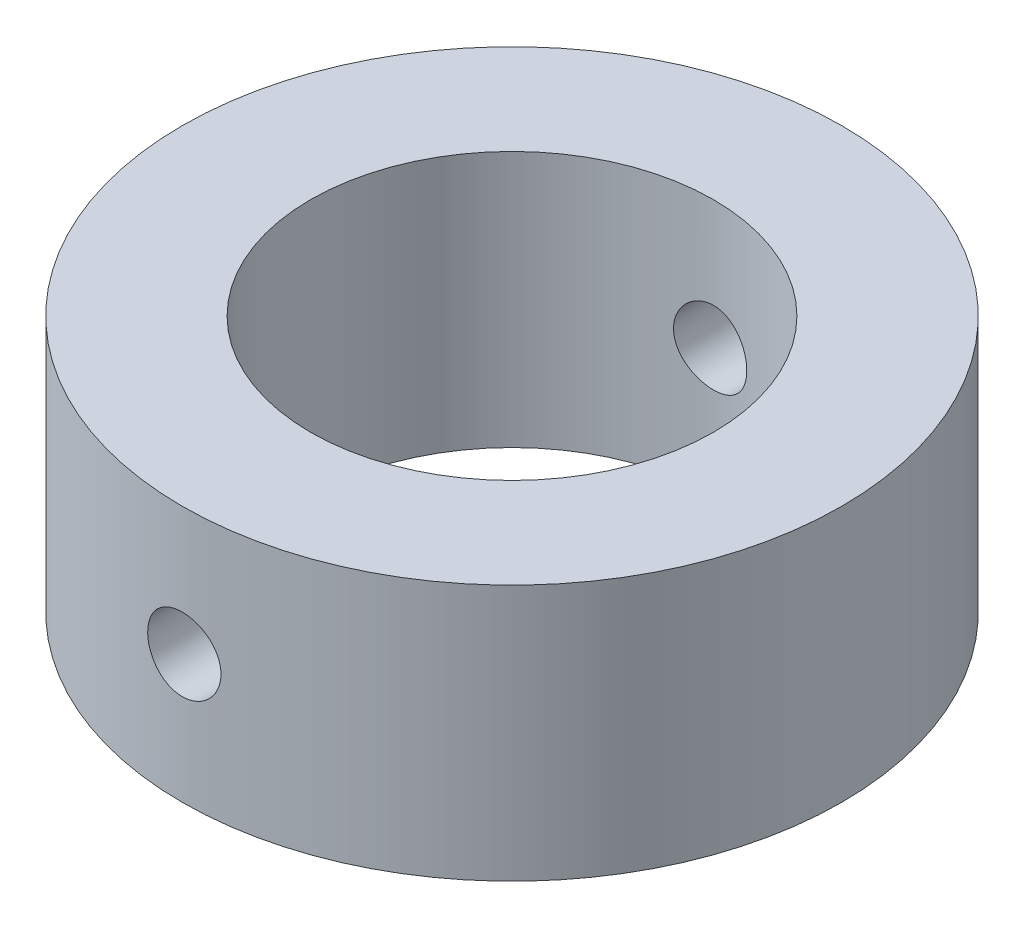
ISO-10303-21;
HEADER;
FILE_DESCRIPTION(('STEP AP214'),'2;1');
FILE_NAME('part.step','',(''),(''),'','','');
FILE_SCHEMA(('AUTOMOTIVE_DESIGN { 1 0 10303 214 1 1 1 1 }'));
ENDSEC;
DATA;
#1=APPLICATION_CONTEXT('core data for automotive mechanical design processes');
#2=APPLICATION_PROTOCOL_DEFINITION('international standard','automotive_design',2000,#1);
#3=PRODUCT_CONTEXT('',#1,'mechanical');
#4=PRODUCT('Part','Part','',(#3));
#5=PRODUCT_RELATED_PRODUCT_CATEGORY('part','',(#4));
#6=PRODUCT_DEFINITION_FORMATION('','',#4);
#7=PRODUCT_DEFINITION_CONTEXT('part definition',#1,'design');
#8=PRODUCT_DEFINITION('design','',#6,#7);
#9=PRODUCT_DEFINITION_SHAPE('','',#8);
#10=(LENGTH_UNIT() NAMED_UNIT(*) SI_UNIT(.MILLI.,.METRE.));
#11=(NAMED_UNIT(*) PLANE_ANGLE_UNIT() SI_UNIT($,.RADIAN.));
#12=(NAMED_UNIT(*) SI_UNIT($,.STERADIAN.) SOLID_ANGLE_UNIT());
#13=UNCERTAINTY_MEASURE_WITH_UNIT(LENGTH_MEASURE(1.E-05),#10,'distance_accuracy_value','');
#14=(GEOMETRIC_REPRESENTATION_CONTEXT(3) GLOBAL_UNCERTAINTY_ASSIGNED_CONTEXT((#13)) GLOBAL_UNIT_ASSIGNED_CONTEXT((#10,
#11,#12)) REPRESENTATION_CONTEXT('',''));
#15=CARTESIAN_POINT('',(0.,0.,0.));
#16=DIRECTION('',(0.,0.,1.));
#17=DIRECTION('',(1.,0.,0.));
#18=AXIS2_PLACEMENT_3D('',#15,#16,#17);
#19=CARTESIAN_POINT('',(0.,-7.728,0.));
#20=DIRECTION('',(0.,-1.,0.));
#21=DIRECTION('',(0.,0.,-1.));
#22=AXIS2_PLACEMENT_3D('',#19,#20,#21);
#23=CYLINDRICAL_SURFACE('',#22,11.);
#24=CARTESIAN_POINT('',(0.,2.,-11.));
#25=CARTESIAN_POINT('',(-0.111357271644373,1.99999568133932,-10.9999980072786));
#26=CARTESIAN_POINT('',(-0.222771449918202,1.99066824251735,-10.9982915273343));
#27=CARTESIAN_POINT('',(-0.442464406848309,1.95362653397508,-10.99164847502));
#28=CARTESIAN_POINT('',(-0.550740387266074,1.92589635141863,-10.9867091072254));
#29=CARTESIAN_POINT('',(-0.760947572513747,1.85292287032901,-10.9741532323507));
#30=CARTESIAN_POINT('',(-0.862884263930176,1.80769496781024,-10.9665390793192));
#31=CARTESIAN_POINT('',(-1.0577120033845,1.70105266880821,-10.949466714983));
#32=CARTESIAN_POINT('',(-1.15060386767904,1.63963973481181,-10.9400086703132));
#33=CARTESIAN_POINT('',(-1.32576444051238,1.50163409035729,-10.9201743349983));
#34=CARTESIAN_POINT('',(-1.40791622603346,1.42489415801924,-10.9097897259708));
#35=CARTESIAN_POINT('',(-1.55825357341079,1.25872964591017,-10.8893349521181));
#36=CARTESIAN_POINT('',(-1.62643816794977,1.16930418831085,-10.8792648091126));
#37=CARTESIAN_POINT('',(-1.74738695016477,0.979487270540227,-10.8604984020977));
#38=CARTESIAN_POINT('',(-1.80003313265556,0.879019464769625,-10.851812871101));
#39=CARTESIAN_POINT('',(-1.88765546949978,0.670481349676033,-10.836915832769));
#40=CARTESIAN_POINT('',(-1.92263305283275,0.562411655974962,-10.8307041253674));
#41=CARTESIAN_POINT('',(-1.97355197711315,0.342985350643402,-10.8215415351671));
#42=CARTESIAN_POINT('',(-1.98969666425445,0.231677408290375,-10.8185558462234));
#43=CARTESIAN_POINT('',(-2.00312248736688,0.0078955926854322,-10.8160783143231));
#44=CARTESIAN_POINT('',(-2.00040521296643,-0.104578181516031,-10.8165861769405));
#45=CARTESIAN_POINT('',(-1.97634934427,-0.326031914133018,-10.8210066504918));
#46=CARTESIAN_POINT('',(-1.95524117699072,-0.435037867895722,-10.8248771281426));
#47=CARTESIAN_POINT('',(-1.89536523340026,-0.647935018367165,-10.8355206127391));
#48=CARTESIAN_POINT('',(-1.85659674743188,-0.75182600935179,-10.8422937363232));
#49=CARTESIAN_POINT('',(-1.76227297789295,-0.952222790778736,-10.8580238155272));
#50=CARTESIAN_POINT('',(-1.7066239037154,-1.04868344266613,-10.8669929171435));
#51=CARTESIAN_POINT('',(-1.58018503374043,-1.23098473694529,-10.8860962201172));
#52=CARTESIAN_POINT('',(-1.50939379023584,-1.31682436264624,-10.8962305328347));
#53=CARTESIAN_POINT('',(-1.35343399418352,-1.47677899644437,-10.9167064080854));
#54=CARTESIAN_POINT('',(-1.2680681726569,-1.55070168843691,-10.9270488181647));
#55=CARTESIAN_POINT('',(-1.08604454069331,-1.68320513348083,-10.9466375043709));
#56=CARTESIAN_POINT('',(-0.989386629498157,-1.74178574962126,-10.9558837707156));
#57=CARTESIAN_POINT('',(-0.787327598497296,-1.84196738978503,-10.9722553782534));
#58=CARTESIAN_POINT('',(-0.681916780395492,-1.88354926869598,-10.9793783255922));
#59=CARTESIAN_POINT('',(-0.465448414462666,-1.9483631924937,-10.9906820547088));
#60=CARTESIAN_POINT('',(-0.354391431316065,-1.97159706857391,-10.994863130091));
#61=CARTESIAN_POINT('',(-0.131438649578499,-1.99878976191912,-10.9997719337866));
#62=CARTESIAN_POINT('',(-0.0195760121089339,-2.00301222345408,-11.0005468934114));
#63=CARTESIAN_POINT('',(0.203257238970967,-1.99276820181851,-10.998686302475));
#64=CARTESIAN_POINT('',(0.314227893453082,-1.97830257992826,-10.9960509090871));
#65=CARTESIAN_POINT('',(0.531297097592757,-1.93131225043812,-10.9876950863245));
#66=CARTESIAN_POINT('',(0.637425297458317,-1.89892013081717,-10.9819973157216));
#67=CARTESIAN_POINT('',(0.84274471375661,-1.81713917147806,-10.9681529512222));
#68=CARTESIAN_POINT('',(0.941935480960949,-1.7677492323023,-10.9600061989244));
#69=CARTESIAN_POINT('',(1.13169524707493,-1.65278536219707,-10.9420497958484));
#70=CARTESIAN_POINT('',(1.22216445208488,-1.58704931284408,-10.932223816146));
#71=CARTESIAN_POINT('',(1.39088213822347,-1.4414796233289,-10.9120428807109));
#72=CARTESIAN_POINT('',(1.46912954974332,-1.36164475058806,-10.901687878785));
#73=CARTESIAN_POINT('',(1.6121773788768,-1.1889531185515,-10.8814603955764));
#74=CARTESIAN_POINT('',(1.67679836741418,-1.09594669347414,-10.8715955212189));
#75=CARTESIAN_POINT('',(1.78949986552014,-0.900243818593513,-10.8536151008102));
#76=CARTESIAN_POINT('',(1.83758096630795,-0.797547715315616,-10.8454994922354));
#77=CARTESIAN_POINT('',(1.91557945241746,-0.585849250308254,-10.8319954461548));
#78=CARTESIAN_POINT('',(1.9455810786184,-0.476878769261946,-10.8265943801675));
#79=CARTESIAN_POINT('',(1.98683040178554,-0.255337011368931,-10.8191012654539));
#80=CARTESIAN_POINT('',(1.99808007453629,-0.142766115151078,-10.8170088681136));
#81=CARTESIAN_POINT('',(2.00144313663184,0.0809853754636368,-10.8163869388262));
#82=CARTESIAN_POINT('',(1.99383937001232,0.192161671438542,-10.8178047454411));
#83=CARTESIAN_POINT('',(1.96032846912815,0.411623638017415,-10.8239270874703));
#84=CARTESIAN_POINT('',(1.93442142905718,0.519909323494285,-10.8286316059701));
#85=CARTESIAN_POINT('',(1.86515567158476,0.73037619739537,-10.8407757208091));
#86=CARTESIAN_POINT('',(1.82182581019232,0.832567160223432,-10.8482107929975));
#87=CARTESIAN_POINT('',(1.71897473664823,1.02827444716474,-10.8649817751485));
#88=CARTESIAN_POINT('',(1.65945247569007,1.12179020884559,-10.8743178082294));
#89=CARTESIAN_POINT('',(1.52491543662799,1.29891287459562,-10.8940032465147));
#90=CARTESIAN_POINT('',(1.44969415553099,1.38236156987076,-10.9043650783111));
#91=CARTESIAN_POINT('',(1.28632651423364,1.53554708101219,-10.9248399206865));
#92=CARTESIAN_POINT('',(1.19817718680093,1.60528074039225,-10.9349528735191));
#93=CARTESIAN_POINT('',(1.0105711896463,1.72960029712349,-10.9538897429719));
#94=CARTESIAN_POINT('',(0.911025849790496,1.78405418518013,-10.9627021317343));
#95=CARTESIAN_POINT('',(0.704073905086344,1.87537921607405,-10.9779326099335));
#96=CARTESIAN_POINT('',(0.59667492548667,1.91226715927832,-10.9843529858473));
#97=CARTESIAN_POINT('',(0.407441749458405,1.95977543030219,-10.9927407037649));
#98=CARTESIAN_POINT('',(0.326725427276489,1.97483433296035,-10.9954478027358));
#99=CARTESIAN_POINT('',(0.164016342132202,1.9949480937949,-10.9990781643304));
#100=CARTESIAN_POINT('',(0.0820236084408326,2.00000318104177,-11.0000014678));
#101=CARTESIAN_POINT('',(0.,2.,-11.));
#102=B_SPLINE_CURVE_WITH_KNOTS('',3,(#24,#25,#26,#27,#28,#29,#30,#31,#32,#33,#34,#35,#36,#37,
#38,#39,#40,#41,#42,#43,#44,#45,#46,#47,#48,#49,#50,#51,#52,#53,#54,#55,#56,#57,#58,#59,#60,#61,
#62,#63,#64,#65,#66,#67,#68,#69,#70,#71,#72,#73,#74,#75,#76,#77,#78,#79,#80,#81,#82,#83,#84,#85,
#86,#87,#88,#89,#90,#91,#92,#93,#94,#95,#96,#97,#98,#99,#100,#101),.UNSPECIFIED.,.T.,.F.,(4,2,2,
2,2,2,2,2,2,2,2,2,2,2,2,2,2,2,2,2,2,2,2,2,2,2,2,2,2,2,2,2,2,2,2,2,2,2,4),(0.,0.333771891552332,
0.66783277207259,1.00160038286674,1.3353378446015,1.67245014596885,2.00958578663078,
2.3492195220365,2.6888257845573,3.02473021172645,3.36060633024202,3.69233367290895,
4.02407434678871,4.35769306461625,4.69134369321255,5.02993210441872,5.36852353704646,
5.70749527023812,6.04643316861453,6.38065600997364,6.71486344850797,7.0466314328543,
7.3784208807422,7.71364226795666,8.04889297616123,8.38831506130458,8.72772501252474,
9.06554101076157,9.40332141303601,9.73606509730371,10.0688070691931,10.4010002025896,
10.733214857769,11.0701111453004,11.4070848782946,11.7468860454293,12.0863615649817,
12.3322171022956,12.5780670098676),.UNSPECIFIED.);
#103=CARTESIAN_POINT('',(0.,2.,-11.));
#104=VERTEX_POINT('',#103);
#105=EDGE_CURVE('E76',#104,#104,#102,.T.);
#106=ORIENTED_EDGE('',*,*,#105,.F.);
#107=EDGE_LOOP('',(#106));
#108=FACE_BOUND('',#107,.T.);
#109=CARTESIAN_POINT('',(2.,0.,10.816653826392));
#110=CARTESIAN_POINT('',(1.99999566748834,-0.11134012257296,10.8166559469823));
#111=CARTESIAN_POINT('',(1.9906710042305,-0.222737191288005,10.818391586416));
#112=CARTESIAN_POINT('',(1.953641319662,-0.442394615872969,10.825138630904));
#113=CARTESIAN_POINT('',(1.92592032102069,-0.550652159669283,10.8301528833982));
#114=CARTESIAN_POINT('',(1.85297369289719,-0.760820313018511,10.8428709030557));
#115=CARTESIAN_POINT('',(1.80776389192774,-0.862736565308052,10.8505722376174));
#116=CARTESIAN_POINT('',(1.70116425408316,-1.05752989162896,10.8677937983012));
#117=CARTESIAN_POINT('',(1.6397758372698,-1.15040775801638,10.8773138647657));
#118=CARTESIAN_POINT('',(1.50179524823966,-1.32558344744176,10.8972247379328));
#119=CARTESIAN_POINT('',(1.4250503534781,-1.40776007423395,10.9076236306456));
#120=CARTESIAN_POINT('',(1.25886539634161,-1.55814556283443,10.9280489317643));
#121=CARTESIAN_POINT('',(1.1694245247635,-1.62635353364538,10.9380753163763));
#122=CARTESIAN_POINT('',(0.979593418999866,-1.74732731845024,10.9567122399244));
#123=CARTESIAN_POINT('',(0.879129490479886,-1.7999792699958,10.965312146403));
#124=CARTESIAN_POINT('',(0.670599774437609,-1.88761333302614,10.9800367733651));
#125=CARTESIAN_POINT('',(0.562534575326679,-1.92259681050937,10.98616168519));
#126=CARTESIAN_POINT('',(0.343124837820858,-1.97352723325545,10.9951891058833));
#127=CARTESIAN_POINT('',(0.231829128518768,-1.98967831432072,10.9981261454525));
#128=CARTESIAN_POINT('',(0.00807147296592509,-2.0031211674624,11.0005658088946));
#129=CARTESIAN_POINT('',(-0.104390378935038,-2.00041445357154,11.0000687084839));
#130=CARTESIAN_POINT('',(-0.32588919614074,-1.97637585792208,10.9957231855211));
#131=CARTESIAN_POINT('',(-0.434950900053349,-1.95526374648556,10.9919143087691));
#132=CARTESIAN_POINT('',(-0.647957490603365,-1.8953608025385,10.9814174690798));
#133=CARTESIAN_POINT('',(-0.751902198979603,-1.85656935461377,10.974729405919));
#134=CARTESIAN_POINT('',(-0.952366225453847,-1.76219694022084,10.9591592037236));
#135=CARTESIAN_POINT('',(-1.04884289251747,-1.70652735596616,10.9502655302338));
#136=CARTESIAN_POINT('',(-1.23116763357293,-1.58004411007531,10.9312689682172));
#137=CARTESIAN_POINT('',(-1.31701468769822,-1.50922899706451,10.9211659638428));
#138=CARTESIAN_POINT('',(-1.47694445054394,-1.35325154542072,10.9006990809284));
#139=CARTESIAN_POINT('',(-1.55083959404949,-1.26789698208101,10.8903335415211));
#140=CARTESIAN_POINT('',(-1.68329271964166,-1.08590593607908,10.8706496206858));
#141=CARTESIAN_POINT('',(-1.74185050296967,-0.989269307234742,10.861331252829));
#142=CARTESIAN_POINT('',(-1.84201538249093,-0.787217489513175,10.8447947340983));
#143=CARTESIAN_POINT('',(-1.88359655385222,-0.681789168360212,10.8375798001274));
#144=CARTESIAN_POINT('',(-1.94840376886998,-0.465282550111631,10.8261173347694));
#145=CARTESIAN_POINT('',(-1.97163175896676,-0.354204853488856,10.8218694887144));
#146=CARTESIAN_POINT('',(-1.99880217851546,-0.13124019879459,10.8168840409274));
#147=CARTESIAN_POINT('',(-2.00301348489165,-0.0193870673303634,10.8160975038278));
#148=CARTESIAN_POINT('',(-1.9927505477885,0.203424550561076,10.8179929515389));
#149=CARTESIAN_POINT('',(-1.97827717035788,0.314383078213963,10.8206747755886));
#150=CARTESIAN_POINT('',(-1.93128609638897,0.531380344052283,10.8291592937867));
#151=CARTESIAN_POINT('',(-1.89890818855376,0.637450384008028,10.8349378000789));
#152=CARTESIAN_POINT('',(-1.81717497571878,0.842659718828443,10.8489439080076));
#153=CARTESIAN_POINT('',(-1.76781848506108,0.941798529085677,10.8571716806773));
#154=CARTESIAN_POINT('',(-1.65290586187994,1.13151919601525,10.8752613415266));
#155=CARTESIAN_POINT('',(-1.58717917941567,1.22199611808438,10.8851400484298));
#156=CARTESIAN_POINT('',(-1.44162304950736,1.39073369159775,10.9053706629202));
#157=CARTESIAN_POINT('',(-1.36179241301324,1.46899331199966,10.91572261035));
#158=CARTESIAN_POINT('',(-1.18909630007261,1.61207284614979,10.9358898604531));
#159=CARTESIAN_POINT('',(-1.09608023252376,1.6767123553618,10.9456968282676));
#160=CARTESIAN_POINT('',(-0.900352619793527,1.789446306083,10.9635308137777));
#161=CARTESIAN_POINT('',(-0.797641432067847,1.83754135727717,10.9715578970606));
#162=CARTESIAN_POINT('',(-0.585948218345343,1.91554803863644,10.9848917263157));
#163=CARTESIAN_POINT('',(-0.477000329353951,1.94554990487653,10.9902119510479));
#164=CARTESIAN_POINT('',(-0.25550664896348,1.98680734329716,10.9975899747809));
#165=CARTESIAN_POINT('',(-0.14296121367923,1.99806476513671,10.9996480956777));
#166=CARTESIAN_POINT('',(0.0807996190288177,2.00145252110552,11.0002641421388));
#167=CARTESIAN_POINT('',(0.192010837925448,1.99385588848469,10.9988720323112));
#168=CARTESIAN_POINT('',(0.411544538990867,1.96034705357606,10.9928473390214));
#169=CARTESIAN_POINT('',(0.519867045363828,1.93443500480099,10.9882147827193));
#170=CARTESIAN_POINT('',(0.730415433440433,1.86514309651073,10.9762290690773));
#171=CARTESIAN_POINT('',(0.832650596646201,1.82179065462444,10.96888018348));
#172=CARTESIAN_POINT('',(1.02843701194217,1.71888059719124,10.9522592239203));
#173=CARTESIAN_POINT('',(1.12198772879735,1.65932198372258,10.9429870315355));
#174=CARTESIAN_POINT('',(1.29911459753549,1.52474236143811,10.9233859020729));
#175=CARTESIAN_POINT('',(1.38253889858449,1.44952330461567,10.9130443794735));
#176=CARTESIAN_POINT('',(1.53567622355086,1.28617048330647,10.8925517029222));
#177=CARTESIAN_POINT('',(1.60538602436339,1.19803369143839,10.8824005942262));
#178=CARTESIAN_POINT('',(1.72967671803608,1.01044032439889,10.8633428283932));
#179=CARTESIAN_POINT('',(1.78412208501856,0.910892760688651,10.8544476470463));
#180=CARTESIAN_POINT('',(1.87543058906983,0.703936723274017,10.8390461745677));
#181=CARTESIAN_POINT('',(1.9123105996278,0.596535908392186,10.8325375922296));
#182=CARTESIAN_POINT('',(1.95979896205519,0.407323315567744,10.8240281075057));
#183=CARTESIAN_POINT('',(1.97484899189766,0.326630737391384,10.821278872104));
#184=CARTESIAN_POINT('',(1.99495098425024,0.163969047967817,10.8175909727573));
#185=CARTESIAN_POINT('',(2.00000319081575,0.0819999679303415,10.8166522646159));
#186=CARTESIAN_POINT('',(2.,0.,10.816653826392));
#187=B_SPLINE_CURVE_WITH_KNOTS('',3,(#109,#110,#111,#112,#113,#114,#115,#116,#117,#118,#119,
#120,#121,#122,#123,#124,#125,#126,#127,#128,#129,#130,#131,#132,#133,#134,#135,#136,#137,#138,
#139,#140,#141,#142,#143,#144,#145,#146,#147,#148,#149,#150,#151,#152,#153,#154,#155,#156,#157,
#158,#159,#160,#161,#162,#163,#164,#165,#166,#167,#168,#169,#170,#171,#172,#173,#174,#175,#176,
#177,#178,#179,#180,#181,#182,#183,#184,#185,#186),.UNSPECIFIED.,.T.,.F.,(4,2,2,2,2,2,2,2,2,2,2,
2,2,2,2,2,2,2,2,2,2,2,2,2,2,2,2,2,2,2,2,2,2,2,2,2,2,2,4),(0.,0.333720352628771,
0.667730923425361,1.00143989738151,1.33511959011685,1.6722993511526,2.00950061266478,
2.34911212511978,2.6886973772514,3.02456639415963,3.3604084455173,3.69229445292967,
4.02419201411038,4.3578632848798,4.69156654523441,5.03008350848145,5.36860485839155,
5.70764124486732,6.04664167012788,6.38083364646979,6.71501013332593,7.04661365662176,
7.37824034134339,7.71347820234125,8.04874433945132,8.38820522569594,8.72765360102077,
9.06539473675368,9.40310254298626,9.73594847886932,10.0687916249998,10.4011135484041,
10.7334559397116,11.0702887970716,11.4072007206838,11.7470154829573,12.0865031534681,
12.3322881015162,12.5780670496697),.UNSPECIFIED.);
#188=CARTESIAN_POINT('',(2.,0.,10.816653826392));
#189=VERTEX_POINT('',#188);
#190=EDGE_CURVE('E71',#189,#189,#187,.T.);
#191=ORIENTED_EDGE('',*,*,#190,.F.);
#192=EDGE_LOOP('',(#191));
#193=FACE_BOUND('',#192,.T.);
#194=CARTESIAN_POINT('',(0.,-7.,0.));
#195=DIRECTION('',(0.,-1.,0.));
#196=DIRECTION('',(0.,0.,-1.));
#197=AXIS2_PLACEMENT_3D('',#194,#195,#196);
#198=CIRCLE('',#197,11.);
#199=CARTESIAN_POINT('',(0.,-7.,-11.));
#200=VERTEX_POINT('',#199);
#201=EDGE_CURVE('E10',#200,#200,#198,.T.);
#202=ORIENTED_EDGE('',*,*,#201,.T.);
#203=EDGE_LOOP('',(#202));
#204=FACE_BOUND('',#203,.T.);
#205=CARTESIAN_POINT('',(0.,7.,0.));
#206=DIRECTION('',(0.,-1.,0.));
#207=DIRECTION('',(0.,0.,-1.));
#208=AXIS2_PLACEMENT_3D('',#205,#206,#207);
#209=CIRCLE('',#208,11.);
#210=CARTESIAN_POINT('',(0.,7.,-11.));
#211=VERTEX_POINT('',#210);
#212=EDGE_CURVE('E82',#211,#211,#209,.T.);
#213=ORIENTED_EDGE('',*,*,#212,.F.);
#214=EDGE_LOOP('',(#213));
#215=FACE_BOUND('',#214,.T.);
#216=ADVANCED_FACE('F31',(#108,#193,#204,#215),#23,.F.);
#217=CARTESIAN_POINT('',(18.,-7.,0.));
#218=DIRECTION('',(0.,-1.,0.));
#219=DIRECTION('',(0.,0.,-1.));
#220=AXIS2_PLACEMENT_3D('',#217,#218,#219);
#221=PLANE('',#220);
#222=CARTESIAN_POINT('',(0.,-7.,0.));
#223=DIRECTION('',(0.,-1.,0.));
#224=DIRECTION('',(0.,0.,-1.));
#225=AXIS2_PLACEMENT_3D('',#222,#223,#224);
#226=CIRCLE('',#225,18.);
#227=CARTESIAN_POINT('',(0.,-7.,-18.));
#228=VERTEX_POINT('',#227);
#229=EDGE_CURVE('E44',#228,#228,#226,.T.);
#230=ORIENTED_EDGE('',*,*,#229,.T.);
#231=EDGE_LOOP('',(#230));
#232=FACE_BOUND('',#231,.T.);
#233=ORIENTED_EDGE('',*,*,#201,.F.);
#234=EDGE_LOOP('',(#233));
#235=FACE_BOUND('',#234,.T.);
#236=ADVANCED_FACE('F94',(#232,#235),#221,.T.);
#237=CARTESIAN_POINT('',(0.,-7.728,0.));
#238=DIRECTION('',(0.,-1.,0.));
#239=DIRECTION('',(0.,0.,-1.));
#240=AXIS2_PLACEMENT_3D('',#237,#238,#239);
#241=CYLINDRICAL_SURFACE('',#240,18.);
#242=CARTESIAN_POINT('',(0.,2.,-18.));
#243=CARTESIAN_POINT('',(0.111970632349519,1.99999518717274,-17.9999985855436));
#244=CARTESIAN_POINT('',(0.22401360296951,1.99056525489512,-17.9989441411048));
#245=CARTESIAN_POINT('',(0.444988473846702,1.95309247157582,-17.9948391595619));
#246=CARTESIAN_POINT('',(0.553916889117786,1.92502956094916,-17.9917864712715));
#247=CARTESIAN_POINT('',(0.765431079070291,1.85112204481784,-17.9840293073923));
#248=CARTESIAN_POINT('',(0.868020820737628,1.8052886941403,-17.9793258774716));
#249=CARTESIAN_POINT('',(1.06403053009986,1.69716438580146,-17.9687919810869));
#250=CARTESIAN_POINT('',(1.1574522117349,1.63487651233084,-17.9629617258869));
#251=CARTESIAN_POINT('',(1.33290575747026,1.49531794987183,-17.9507977181856));
#252=CARTESIAN_POINT('',(1.4148915795421,1.41798953514322,-17.9444620831364));
#253=CARTESIAN_POINT('',(1.56475003710051,1.2506685239635,-17.9320167832537));
#254=CARTESIAN_POINT('',(1.63262199299226,1.16067531804146,-17.9259071293129));
#255=CARTESIAN_POINT('',(1.7524930181623,0.970286071769773,-17.9145866794937));
#256=CARTESIAN_POINT('',(1.80444975542339,0.869863222950149,-17.9093782965755));
#257=CARTESIAN_POINT('',(1.89074517800796,0.661650539312929,-17.9004741803531));
#258=CARTESIAN_POINT('',(1.92508439501976,0.553860926931999,-17.8967784014));
#259=CARTESIAN_POINT('',(1.97503194492644,0.334448002135696,-17.8913354423153));
#260=CARTESIAN_POINT('',(1.99071729842217,0.222842424929062,-17.8895802517469));
#261=CARTESIAN_POINT('',(2.00315006003506,-0.00142986183008502,-17.8881925066123));
#262=CARTESIAN_POINT('',(1.99989807564483,-0.114096537227774,-17.8885598839559));
#263=CARTESIAN_POINT('',(1.97461184427901,-0.336759474971588,-17.891368441014));
#264=CARTESIAN_POINT('',(1.95266200172973,-0.446765456674598,-17.8938003012309));
#265=CARTESIAN_POINT('',(1.89073461157689,-0.661522625388757,-17.9004492717341));
#266=CARTESIAN_POINT('',(1.85075676930152,-0.766273726476568,-17.904666411201));
#267=CARTESIAN_POINT('',(1.75381606079451,-0.967812423163108,-17.9144214425039));
#268=CARTESIAN_POINT('',(1.6968160688148,-1.06458201601582,-17.9199622158801));
#269=CARTESIAN_POINT('',(1.56747570663675,-1.24721365073087,-17.9317378723191));
#270=CARTESIAN_POINT('',(1.49513478176794,-1.33307529802335,-17.9379727804753));
#271=CARTESIAN_POINT('',(1.33669614893956,-1.49194398430861,-17.9504756897929));
#272=CARTESIAN_POINT('',(1.25052560566827,-1.56487840522475,-17.9567436860931));
#273=CARTESIAN_POINT('',(1.06712581996098,-1.69525838167234,-17.9685745710182));
#274=CARTESIAN_POINT('',(0.969896560277035,-1.75270391304576,-17.9741374585434));
#275=CARTESIAN_POINT('',(0.767086635535504,-1.85047376476476,-17.9839338102592));
#276=CARTESIAN_POINT('',(0.661504004801704,-1.89079404097506,-17.9881669603705));
#277=CARTESIAN_POINT('',(0.445009755639361,-1.95311377504167,-17.9948238450129));
#278=CARTESIAN_POINT('',(0.334098334257908,-1.97511390978633,-17.997247646395));
#279=CARTESIAN_POINT('',(0.110723331894269,-2.00007590171753,-18.0000041106556));
#280=CARTESIAN_POINT('',(-0.00172892889089294,-2.00313789379621,-18.0003477720089));
#281=CARTESIAN_POINT('',(-0.225544988687161,-1.99040020748693,-17.998934812043));
#282=CARTESIAN_POINT('',(-0.33690880589132,-1.97460084490708,-17.9971782258895));
#283=CARTESIAN_POINT('',(-0.555095059423331,-1.92467205954415,-17.9917690933051));
#284=CARTESIAN_POINT('',(-0.661928438561836,-1.89058988188252,-17.9881214344582));
#285=CARTESIAN_POINT('',(-0.868362270126896,-1.80511172227189,-17.9793390034163));
#286=CARTESIAN_POINT('',(-0.967962524792293,-1.75371526714897,-17.9742041905801));
#287=CARTESIAN_POINT('',(-1.15755326511746,-1.63482170892903,-17.9629935700227));
#288=CARTESIAN_POINT('',(-1.24750253139102,-1.56725923906018,-17.9569139780361));
#289=CARTESIAN_POINT('',(-1.41481983480219,-1.41804470166563,-17.9445071585437));
#290=CARTESIAN_POINT('',(-1.49218748015557,-1.33639219554766,-17.938179923334));
#291=CARTESIAN_POINT('',(-1.63249622432816,-1.16087671093394,-17.925957484036));
#292=CARTESIAN_POINT('',(-1.69537132537921,-1.06696080952172,-17.920064336427));
#293=CARTESIAN_POINT('',(-1.80445556005008,-0.869843716507564,-17.9094097287311));
#294=CARTESIAN_POINT('',(-1.85066496700075,-0.766642677224086,-17.9046482500845));
#295=CARTESIAN_POINT('',(-1.92499712101143,-0.554105541283379,-17.8968094822665));
#296=CARTESIAN_POINT('',(-1.95315827481128,-0.44478301425242,-17.8937286188355));
#297=CARTESIAN_POINT('',(-1.99071877766797,-0.222924852258367,-17.8895891957456));
#298=CARTESIAN_POINT('',(-2.00011880320655,-0.11038933329655,-17.8885305631698));
#299=CARTESIAN_POINT('',(-1.99987957341679,0.114044155065053,-17.8885572584665));
#300=CARTESIAN_POINT('',(-1.99034399043058,0.225942250680951,-17.8896309120887));
#301=CARTESIAN_POINT('',(-1.9527225008048,0.446535738325604,-17.8937762295707));
#302=CARTESIAN_POINT('',(-1.92463658036714,0.555231127972063,-17.8968478949167));
#303=CARTESIAN_POINT('',(-1.85074191262564,0.766327510509217,-17.9046397451111));
#304=CARTESIAN_POINT('',(-1.80493703938195,0.868729873635424,-17.9093595695852));
#305=CARTESIAN_POINT('',(-1.69691508787252,1.0644104934481,-17.9199166120206));
#306=CARTESIAN_POINT('',(-1.63469797623759,1.15768873158296,-17.9257538322538));
#307=CARTESIAN_POINT('',(-1.49522995253707,1.33300424612643,-17.9379262794022));
#308=CARTESIAN_POINT('',(-1.41790170900318,1.41497983547593,-17.944263963574));
#309=CARTESIAN_POINT('',(-1.25056419248413,1.5648338722108,-17.9567010614173));
#310=CARTESIAN_POINT('',(-1.16055190760651,1.63270896185917,-17.962800418056));
#311=CARTESIAN_POINT('',(-0.970094486774868,1.75260433035013,-17.9740935209669));
#312=CARTESIAN_POINT('',(-0.869618446416091,1.80457574973094,-17.9792844558708));
#313=CARTESIAN_POINT('',(-0.66136849516123,1.89083749244483,-17.9881463543356));
#314=CARTESIAN_POINT('',(-0.55360283994444,1.92514745073418,-17.9918190049356));
#315=CARTESIAN_POINT('',(-0.371040239312598,1.96669916146577,-17.9963232552591));
#316=CARTESIAN_POINT('',(-0.297404134861362,1.97916954843922,-17.9976954860037));
#317=CARTESIAN_POINT('',(-0.149189389902707,1.99582154886399,-17.9995343271896));
#318=CARTESIAN_POINT('',(-0.0746107544775069,2.00000320698978,-18.000000942512));
#319=CARTESIAN_POINT('',(0.,2.,-18.));
#320=B_SPLINE_CURVE_WITH_KNOTS('',3,(#242,#243,#244,#245,#246,#247,#248,#249,#250,#251,#252,
#253,#254,#255,#256,#257,#258,#259,#260,#261,#262,#263,#264,#265,#266,#267,#268,#269,#270,#271,
#272,#273,#274,#275,#276,#277,#278,#279,#280,#281,#282,#283,#284,#285,#286,#287,#288,#289,#290,
#291,#292,#293,#294,#295,#296,#297,#298,#299,#300,#301,#302,#303,#304,#305,#306,#307,#308,#309,
#310,#311,#312,#313,#314,#315,#316,#317,#318,#319),.UNSPECIFIED.,.T.,.F.,(4,2,2,2,2,2,2,2,2,2,2,
2,2,2,2,2,2,2,2,2,2,2,2,2,2,2,2,2,2,2,2,2,2,2,2,2,2,2,4),(0.,0.335639414270807,
0.671640752838988,1.00742963320074,1.34315561881719,1.68019649784365,2.01725360192296,
2.35519959306228,2.69313538455338,3.02967096220247,3.36619574415512,3.70120941343134,
4.03622855878184,4.37198379333011,4.70775116959619,5.0453487253329,5.3829468076176,
5.72062456954608,6.05828985448105,6.39416820670407,6.73004093517319,7.06504987759405,
7.40006797606269,7.73646430887643,8.07287111486782,8.41078088557856,8.74868511404414,
9.08586787252136,9.42303847276942,9.75836815539861,10.0936980874527,10.4289547445926,
10.7642120833782,11.1012322946639,11.4383326684529,11.7764585228658,12.1142076528796,
12.3378595549845,12.5615102516508),.UNSPECIFIED.);
#321=CARTESIAN_POINT('',(0.,2.,-18.));
#322=VERTEX_POINT('',#321);
#323=EDGE_CURVE('E35',#322,#322,#320,.T.);
#324=ORIENTED_EDGE('',*,*,#323,.F.);
#325=EDGE_LOOP('',(#324));
#326=FACE_BOUND('',#325,.T.);
#327=CARTESIAN_POINT('',(2.,0.,17.8885438199983));
#328=CARTESIAN_POINT('',(1.99999518503575,0.111968226954188,17.8885452673513));
#329=CARTESIAN_POINT('',(1.99056564422495,0.22400879952899,17.8896064083062));
#330=CARTESIAN_POINT('',(1.9530945571327,0.444978688113826,17.8937353069379));
#331=CARTESIAN_POINT('',(1.92503294287933,0.553904517249662,17.8968052281518));
#332=CARTESIAN_POINT('',(1.85112921882987,0.765413238050207,17.9045997629771));
#333=CARTESIAN_POINT('',(1.80529842543048,0.868000118596708,17.9093233232741));
#334=CARTESIAN_POINT('',(1.6971801398522,1.0640050312931,17.9198916263535));
#335=CARTESIAN_POINT('',(1.63489572561389,1.15742477384015,17.9257361593821));
#336=CARTESIAN_POINT('',(1.49534066211955,1.33288049818134,17.9379170304468));
#337=CARTESIAN_POINT('',(1.41801151386004,1.41486982635829,17.9442552283822));
#338=CARTESIAN_POINT('',(1.25068756201248,1.56473505390659,17.956692464558));
#339=CARTESIAN_POINT('',(1.16069215853742,1.6326102844422,17.9627914914535));
#340=CARTESIAN_POINT('',(0.970300975910865,1.75248474260362,17.9740818874251));
#341=CARTESIAN_POINT('',(0.869878766261949,1.80444223723359,17.9792708555609));
#342=CARTESIAN_POINT('',(0.661667471517998,1.89073923619886,17.9881361419533));
#343=CARTESIAN_POINT('',(0.553878605135573,1.92507926333131,17.9918125050956));
#344=CARTESIAN_POINT('',(0.334468008621896,1.97502849322176,17.9972252779851));
#345=CARTESIAN_POINT('',(0.222864029559306,1.99071479178831,17.9989696704928));
#346=CARTESIAN_POINT('',(-0.00140512478551102,2.00314999730295,18.0003491557537));
#347=CARTESIAN_POINT('',(-0.114070266492344,1.99989950141874,17.999984315021));
#348=CARTESIAN_POINT('',(-0.336739745879572,1.97461563521794,17.9971929428148));
#349=CARTESIAN_POINT('',(-0.446753627473802,1.95266517064822,17.9947755115965));
#350=CARTESIAN_POINT('',(-0.661526274498665,1.89073380147306,17.9881609397357));
#351=CARTESIAN_POINT('',(-0.766284958137244,1.85075261633365,17.983963771403));
#352=CARTESIAN_POINT('',(-0.967832879518122,1.75380496878332,17.9742457977887));
#353=CARTESIAN_POINT('',(-1.06460449111718,1.69680215768824,17.9687221649126));
#354=CARTESIAN_POINT('',(-1.2472389694308,1.56745576931318,17.9569703102514));
#355=CARTESIAN_POINT('',(-1.33310144059904,1.49511163603744,17.9507420629336));
#356=CARTESIAN_POINT('',(-1.49196653465317,1.33667071691282,17.9382394115377));
#357=CARTESIAN_POINT('',(-1.56489718633274,1.25050175345599,17.9319649398659));
#358=CARTESIAN_POINT('',(-1.69527030904771,1.06710647531464,17.9201104242365));
#359=CARTESIAN_POINT('',(-1.75271274805118,0.969880137762416,17.9145303817151));
#360=CARTESIAN_POINT('',(-1.85048037105374,0.767071026530246,17.9046962899179));
#361=CARTESIAN_POINT('',(-1.89080055980943,0.661485824880405,17.9004426276963));
#362=CARTESIAN_POINT('',(-1.95311933213687,0.444985984242083,17.8937507545429));
#363=CARTESIAN_POINT('',(-1.97511860833,0.334071546892834,17.891312474981));
#364=CARTESIAN_POINT('',(-2.00007735935568,0.11069510696495,17.8885396347188));
#365=CARTESIAN_POINT('',(-2.00313777083876,-0.00175548459326164,17.8881939216838));
#366=CARTESIAN_POINT('',(-1.99039751910215,-0.225567827031347,17.8896159038576));
#367=CARTESIAN_POINT('',(-1.97459717180621,-0.336929596117845,17.8913835636668));
#368=CARTESIAN_POINT('',(-1.92466859187558,-0.555105485339679,17.8968229651343));
#369=CARTESIAN_POINT('',(-1.89058856475884,-0.661930772675792,17.9004896978583));
#370=CARTESIAN_POINT('',(-1.80511741398991,-0.868349371183926,17.9093100409564));
#371=CARTESIAN_POINT('',(-1.75372580444061,-0.967942479269591,17.9144636930643));
#372=CARTESIAN_POINT('',(-1.63483941033055,-1.1575282931936,17.9257040762847));
#373=CARTESIAN_POINT('',(-1.56727802875607,-1.24747900693807,17.9317946280501));
#374=CARTESIAN_POINT('',(-1.41806481392953,-1.41479973723392,17.9442102793975));
#375=CARTESIAN_POINT('',(-1.33641254922635,-1.49216936842207,17.9505353861566));
#376=CARTESIAN_POINT('',(-1.16089620972329,-1.63248248532022,17.9627413925405));
#377=CARTESIAN_POINT('',(-1.06697916673199,-1.69535992327816,17.968620179616));
#378=CARTESIAN_POINT('',(-0.869859159636977,-1.80444825682681,17.9792400807963));
#379=CARTESIAN_POINT('',(-0.766656348352902,-1.85065942663837,17.9839812136192));
#380=CARTESIAN_POINT('',(-0.554120264945933,-1.92499272889714,17.9917821449637));
#381=CARTESIAN_POINT('',(-0.444800831566823,-1.95315403200578,17.9948455821934));
#382=CARTESIAN_POINT('',(-0.222949200757917,-1.99071588146752,17.9989609669259));
#383=CARTESIAN_POINT('',(-0.110417116473332,-2.00011708770109,18.0000129851797));
#384=CARTESIAN_POINT('',(0.114018334496894,-1.99988133626741,17.9999868395735));
#385=CARTESIAN_POINT('',(0.225921823844598,-1.99034661842582,17.9989201153349));
#386=CARTESIAN_POINT('',(0.446526316926466,-1.95272496321899,17.9947989686735));
#387=CARTESIAN_POINT('',(0.555227319914946,-1.92463802153398,17.9917445457879));
#388=CARTESIAN_POINT('',(0.766335076615752,-1.85073915596262,17.9839899544047));
#389=CARTESIAN_POINT('',(0.86874317607688,-1.8049310371763,17.9792901392271));
#390=CARTESIAN_POINT('',(1.06443391664963,-1.69690081603447,17.9687671981842));
#391=CARTESIAN_POINT('',(1.15771654277213,-1.63467868671863,17.9629440704738));
#392=CARTESIAN_POINT('',(1.33303189850074,-1.49520510358297,17.9507882968297));
#393=CARTESIAN_POINT('',(1.41500385164123,-1.41787746860296,17.9444531678765));
#394=CARTESIAN_POINT('',(1.56485083590747,-1.2505426709214,17.9320080016661));
#395=CARTESIAN_POINT('',(1.63272249971267,-1.16053248806638,17.9258980184622));
#396=CARTESIAN_POINT('',(1.75261413385152,-0.970076820326278,17.9145748576723));
#397=CARTESIAN_POINT('',(1.80458464165387,-0.869600051342168,17.9093644999484));
#398=CARTESIAN_POINT('',(1.89084447897051,-0.66134856315658,17.9004638112766));
#399=CARTESIAN_POINT('',(1.92515345522498,-0.553582104730511,17.8967717922482));
#400=CARTESIAN_POINT('',(1.96670243154842,-0.371022125055509,17.8922425310128));
#401=CARTESIAN_POINT('',(1.97917158766845,-0.297389637680329,17.8908622174332));
#402=CARTESIAN_POINT('',(1.99582195322212,-0.149182136930696,17.8890123822324));
#403=CARTESIAN_POINT('',(2.00000320832675,-0.0746071287523425,17.8885428555921));
#404=CARTESIAN_POINT('',(2.,0.,17.8885438199983));
#405=B_SPLINE_CURVE_WITH_KNOTS('',3,(#327,#328,#329,#330,#331,#332,#333,#334,#335,#336,#337,
#338,#339,#340,#341,#342,#343,#344,#345,#346,#347,#348,#349,#350,#351,#352,#353,#354,#355,#356,
#357,#358,#359,#360,#361,#362,#363,#364,#365,#366,#367,#368,#369,#370,#371,#372,#373,#374,#375,
#376,#377,#378,#379,#380,#381,#382,#383,#384,#385,#386,#387,#388,#389,#390,#391,#392,#393,#394,
#395,#396,#397,#398,#399,#400,#401,#402,#403,#404),.UNSPECIFIED.,.T.,.F.,(4,2,2,2,2,2,2,2,2,2,2,
2,2,2,2,2,2,2,2,2,2,2,2,2,2,2,2,2,2,2,2,2,2,2,2,2,2,2,4),(0.,0.335632188624974,
0.671626462934656,1.00740710805003,1.34312498388733,1.68017531935543,2.01724162325253,
2.35518422792107,2.69311680358594,3.02964779613957,3.36616817631889,3.70120432175367,
4.03624568008393,4.37200767925155,4.70778184908852,5.04536979065502,5.3829584303983,
5.7206454906652,6.0583197841067,6.39419284630556,6.73006028260191,7.06504632328859,
7.40004176706191,7.73644141772486,8.07285137049336,8.41076545330537,8.74867397594563,
9.08584668590625,9.42300753571449,9.7583529180042,10.0936983783768,10.4289718731341,
10.7642459185884,11.1012566562892,11.4383477839705,11.7764770582129,12.1142293791938,
12.3378704296957,12.5615102478061),.UNSPECIFIED.);
#406=CARTESIAN_POINT('',(2.,0.,17.8885438199983));
#407=VERTEX_POINT('',#406);
#408=EDGE_CURVE('E52',#407,#407,#405,.T.);
#409=ORIENTED_EDGE('',*,*,#408,.F.);
#410=EDGE_LOOP('',(#409));
#411=FACE_BOUND('',#410,.T.);
#412=CARTESIAN_POINT('',(0.,7.,0.));
#413=DIRECTION('',(0.,-1.,0.));
#414=DIRECTION('',(0.,0.,-1.));
#415=AXIS2_PLACEMENT_3D('',#412,#413,#414);
#416=CIRCLE('',#415,18.);
#417=CARTESIAN_POINT('',(0.,7.,-18.));
#418=VERTEX_POINT('',#417);
#419=EDGE_CURVE('E49',#418,#418,#416,.T.);
#420=ORIENTED_EDGE('',*,*,#419,.T.);
#421=EDGE_LOOP('',(#420));
#422=FACE_BOUND('',#421,.T.);
#423=ORIENTED_EDGE('',*,*,#229,.F.);
#424=EDGE_LOOP('',(#423));
#425=FACE_BOUND('',#424,.T.);
#426=ADVANCED_FACE('F57',(#326,#411,#422,#425),#241,.T.);
#427=CARTESIAN_POINT('',(18.,7.,0.));
#428=DIRECTION('',(0.,1.,0.));
#429=DIRECTION('',(0.,0.,1.));
#430=AXIS2_PLACEMENT_3D('',#427,#428,#429);
#431=PLANE('',#430);
#432=ORIENTED_EDGE('',*,*,#212,.T.);
#433=EDGE_LOOP('',(#432));
#434=FACE_BOUND('',#433,.T.);
#435=ORIENTED_EDGE('',*,*,#419,.F.);
#436=EDGE_LOOP('',(#435));
#437=FACE_BOUND('',#436,.T.);
#438=ADVANCED_FACE('F64',(#434,#437),#431,.T.);
#439=CARTESIAN_POINT('',(0.,0.,-26.));
#440=DIRECTION('',(0.,0.,1.));
#441=DIRECTION('',(1.,0.,0.));
#442=AXIS2_PLACEMENT_3D('',#439,#440,#441);
#443=CYLINDRICAL_SURFACE('',#442,2.);
#444=ORIENTED_EDGE('',*,*,#190,.T.);
#445=EDGE_LOOP('',(#444));
#446=FACE_BOUND('',#445,.T.);
#447=ORIENTED_EDGE('',*,*,#408,.T.);
#448=EDGE_LOOP('',(#447));
#449=FACE_BOUND('',#448,.T.);
#450=ADVANCED_FACE('F60',(#446,#449),#443,.F.);
#451=ORIENTED_EDGE('',*,*,#105,.T.);
#452=EDGE_LOOP('',(#451));
#453=FACE_BOUND('',#452,.T.);
#454=ORIENTED_EDGE('',*,*,#323,.T.);
#455=EDGE_LOOP('',(#454));
#456=FACE_BOUND('',#455,.T.);
#457=ADVANCED_FACE('F63',(#453,#456),#443,.F.);
#458=CLOSED_SHELL('',(#216,#236,#426,#438,#450,#457));
#459=MANIFOLD_SOLID_BREP('B2',#458);
#460=ADVANCED_BREP_SHAPE_REPRESENTATION('',(#18,#459),#14);
#461=SHAPE_DEFINITION_REPRESENTATION(#9,#460);
ENDSEC;
END-ISO-10303-21;
